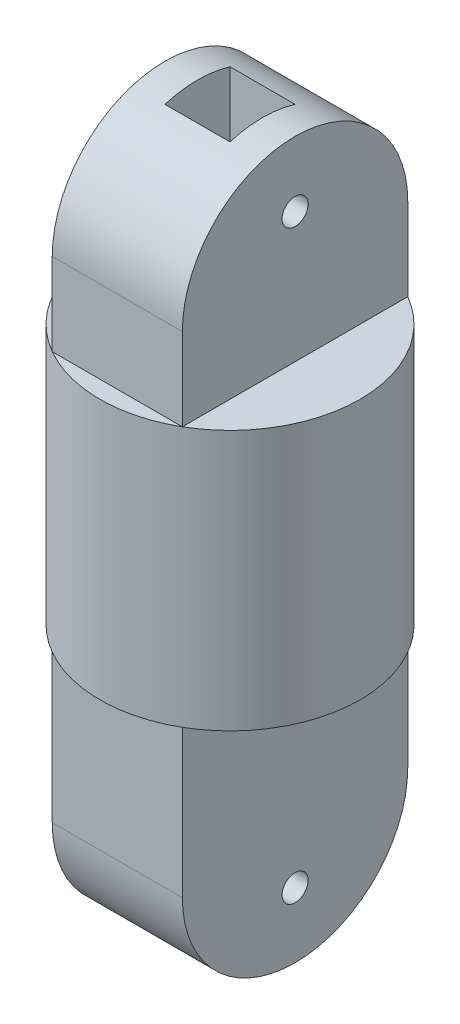
ISO-10303-21;
HEADER;
FILE_DESCRIPTION(('STEP AP214'),'2;1');
FILE_NAME('part.step','',(''),(''),'','','');
FILE_SCHEMA(('AUTOMOTIVE_DESIGN { 1 0 10303 214 1 1 1 1 }'));
ENDSEC;
DATA;
#1=APPLICATION_CONTEXT('core data for automotive mechanical design processes');
#2=APPLICATION_PROTOCOL_DEFINITION('international standard','automotive_design',2000,#1);
#3=PRODUCT_CONTEXT('',#1,'mechanical');
#4=PRODUCT('Part','Part','',(#3));
#5=PRODUCT_RELATED_PRODUCT_CATEGORY('part','',(#4));
#6=PRODUCT_DEFINITION_FORMATION('','',#4);
#7=PRODUCT_DEFINITION_CONTEXT('part definition',#1,'design');
#8=PRODUCT_DEFINITION('design','',#6,#7);
#9=PRODUCT_DEFINITION_SHAPE('','',#8);
#10=(LENGTH_UNIT() NAMED_UNIT(*) SI_UNIT(.MILLI.,.METRE.));
#11=(NAMED_UNIT(*) PLANE_ANGLE_UNIT() SI_UNIT($,.RADIAN.));
#12=(NAMED_UNIT(*) SI_UNIT($,.STERADIAN.) SOLID_ANGLE_UNIT());
#13=UNCERTAINTY_MEASURE_WITH_UNIT(LENGTH_MEASURE(1.E-05),#10,'distance_accuracy_value','');
#14=(GEOMETRIC_REPRESENTATION_CONTEXT(3) GLOBAL_UNCERTAINTY_ASSIGNED_CONTEXT((#13)) GLOBAL_UNIT_ASSIGNED_CONTEXT((#10,
#11,#12)) REPRESENTATION_CONTEXT('',''));
#15=CARTESIAN_POINT('',(0.,0.,0.));
#16=DIRECTION('',(0.,0.,1.));
#17=DIRECTION('',(1.,0.,0.));
#18=AXIS2_PLACEMENT_3D('',#15,#16,#17);
#19=CARTESIAN_POINT('',(-2.5,9.99999999892219,0.));
#20=DIRECTION('',(-1.,0.,0.));
#21=DIRECTION('',(0.,0.,1.));
#22=AXIS2_PLACEMENT_3D('',#19,#20,#21);
#23=CYLINDRICAL_SURFACE('',#22,0.500000015999993);
#24=CARTESIAN_POINT('',(1.25,9.99999999892219,0.));
#25=DIRECTION('',(1.,0.,0.));
#26=DIRECTION('',(0.,0.,-1.));
#27=AXIS2_PLACEMENT_3D('',#24,#25,#26);
#28=CIRCLE('',#27,0.500000015999993);
#29=CARTESIAN_POINT('',(1.25,9.99999999892219,-0.500000015999993));
#30=VERTEX_POINT('',#29);
#31=EDGE_CURVE('E148',#30,#30,#28,.F.);
#32=ORIENTED_EDGE('',*,*,#31,.T.);
#33=EDGE_LOOP('',(#32));
#34=FACE_BOUND('',#33,.T.);
#35=CARTESIAN_POINT('',(2.5,9.99999999892219,0.));
#36=DIRECTION('',(-1.,0.,0.));
#37=DIRECTION('',(0.,0.,1.));
#38=AXIS2_PLACEMENT_3D('',#35,#36,#37);
#39=CIRCLE('',#38,0.500000015999993);
#40=CARTESIAN_POINT('',(2.5,9.99999999892219,0.500000015999993));
#41=VERTEX_POINT('',#40);
#42=EDGE_CURVE('E291',#41,#41,#39,.T.);
#43=ORIENTED_EDGE('',*,*,#42,.F.);
#44=EDGE_LOOP('',(#43));
#45=FACE_BOUND('',#44,.T.);
#46=ADVANCED_FACE('F39',(#34,#45),#23,.F.);
#47=CARTESIAN_POINT('',(2.5,12.5,-4.33012701892219));
#48=DIRECTION('',(-1.,0.,0.));
#49=DIRECTION('',(0.,0.,1.));
#50=AXIS2_PLACEMENT_3D('',#47,#48,#49);
#51=PLANE('',#50);
#52=ORIENTED_EDGE('',*,*,#42,.T.);
#53=EDGE_LOOP('',(#52));
#54=FACE_BOUND('',#53,.T.);
#55=DIRECTION('',(0.,-1.,0.));
#56=VECTOR('',#55,1.);
#57=CARTESIAN_POINT('',(2.5,12.5,-4.33012701892219));
#58=LINE('',#57,#56);
#59=CARTESIAN_POINT('',(2.5,8.16987298,-4.33012701892219));
#60=VERTEX_POINT('',#59);
#61=CARTESIAN_POINT('',(2.5,5.,-4.33012701892219));
#62=VERTEX_POINT('',#61);
#63=EDGE_CURVE('E263',#60,#62,#58,.T.);
#64=ORIENTED_EDGE('',*,*,#63,.F.);
#65=CARTESIAN_POINT('',(2.5,8.16987298,0.));
#66=DIRECTION('',(-1.,0.,0.));
#67=DIRECTION('',(0.,0.,1.));
#68=AXIS2_PLACEMENT_3D('',#65,#66,#67);
#69=CIRCLE('',#68,4.33012701892219);
#70=CARTESIAN_POINT('',(2.5,8.16987298,4.33012701892219));
#71=VERTEX_POINT('',#70);
#72=EDGE_CURVE('E63',#60,#71,#69,.F.);
#73=ORIENTED_EDGE('',*,*,#72,.T.);
#74=DIRECTION('',(0.,-1.,0.));
#75=VECTOR('',#74,1.);
#76=CARTESIAN_POINT('',(2.5,12.5,4.33012701892219));
#77=LINE('',#76,#75);
#78=CARTESIAN_POINT('',(2.5,5.,4.33012701892219));
#79=VERTEX_POINT('',#78);
#80=EDGE_CURVE('E260',#71,#79,#77,.T.);
#81=ORIENTED_EDGE('',*,*,#80,.T.);
#82=DIRECTION('',(0.,0.,-1.));
#83=VECTOR('',#82,1.);
#84=CARTESIAN_POINT('',(2.5,5.,-4.33012701892219));
#85=LINE('',#84,#83);
#86=EDGE_CURVE('E266',#79,#62,#85,.T.);
#87=ORIENTED_EDGE('',*,*,#86,.T.);
#88=EDGE_LOOP('',(#64,#73,#81,#87));
#89=FACE_BOUND('',#88,.T.);
#90=ADVANCED_FACE('F315',(#54,#89),#51,.F.);
#91=CARTESIAN_POINT('',(-2.5,12.5,-4.33012701892219));
#92=DIRECTION('',(1.,0.,0.));
#93=DIRECTION('',(0.,0.,-1.));
#94=AXIS2_PLACEMENT_3D('',#91,#92,#93);
#95=PLANE('',#94);
#96=CARTESIAN_POINT('',(-2.5,9.99999999892219,0.));
#97=DIRECTION('',(-1.,0.,0.));
#98=DIRECTION('',(0.,0.,1.));
#99=AXIS2_PLACEMENT_3D('',#96,#97,#98);
#100=CIRCLE('',#99,0.500000015999988);
#101=CARTESIAN_POINT('',(-2.5,9.99999999892219,0.500000015999988));
#102=VERTEX_POINT('',#101);
#103=EDGE_CURVE('E295',#102,#102,#100,.T.);
#104=ORIENTED_EDGE('',*,*,#103,.F.);
#105=EDGE_LOOP('',(#104));
#106=FACE_BOUND('',#105,.T.);
#107=DIRECTION('',(0.,-1.,0.));
#108=VECTOR('',#107,1.);
#109=CARTESIAN_POINT('',(-2.5,12.5,4.33012701892219));
#110=LINE('',#109,#108);
#111=CARTESIAN_POINT('',(-2.5,8.16987298,4.33012701892219));
#112=VERTEX_POINT('',#111);
#113=CARTESIAN_POINT('',(-2.5,5.,4.33012701892219));
#114=VERTEX_POINT('',#113);
#115=EDGE_CURVE('E257',#112,#114,#110,.T.);
#116=ORIENTED_EDGE('',*,*,#115,.F.);
#117=CARTESIAN_POINT('',(-2.5,8.16987298,0.));
#118=DIRECTION('',(1.,0.,0.));
#119=DIRECTION('',(0.,0.,-1.));
#120=AXIS2_PLACEMENT_3D('',#117,#118,#119);
#121=CIRCLE('',#120,4.33012701892219);
#122=CARTESIAN_POINT('',(-2.5,8.16987298,-4.33012701892219));
#123=VERTEX_POINT('',#122);
#124=EDGE_CURVE('E288',#123,#112,#121,.T.);
#125=ORIENTED_EDGE('',*,*,#124,.F.);
#126=DIRECTION('',(0.,-1.,0.));
#127=VECTOR('',#126,1.);
#128=CARTESIAN_POINT('',(-2.5,12.5,-4.33012701892219));
#129=LINE('',#128,#127);
#130=CARTESIAN_POINT('',(-2.5,5.,-4.33012701892219));
#131=VERTEX_POINT('',#130);
#132=EDGE_CURVE('E254',#123,#131,#129,.T.);
#133=ORIENTED_EDGE('',*,*,#132,.T.);
#134=DIRECTION('',(0.,0.,1.));
#135=VECTOR('',#134,1.);
#136=CARTESIAN_POINT('',(-2.5,5.,-4.33012701892219));
#137=LINE('',#136,#135);
#138=EDGE_CURVE('E274',#131,#114,#137,.T.);
#139=ORIENTED_EDGE('',*,*,#138,.T.);
#140=EDGE_LOOP('',(#116,#125,#133,#139));
#141=FACE_BOUND('',#140,.T.);
#142=ADVANCED_FACE('F322',(#106,#141),#95,.F.);
#143=CARTESIAN_POINT('',(0.,5.,0.));
#144=DIRECTION('',(0.,1.,0.));
#145=DIRECTION('',(0.,0.,1.));
#146=AXIS2_PLACEMENT_3D('',#143,#144,#145);
#147=PLANE('',#146);
#148=DIRECTION('',(-1.,0.,0.));
#149=VECTOR('',#148,1.);
#150=CARTESIAN_POINT('',(-2.5,5.,-4.33012701892219));
#151=LINE('',#150,#149);
#152=EDGE_CURVE('E278',#62,#131,#151,.T.);
#153=ORIENTED_EDGE('',*,*,#152,.F.);
#154=CARTESIAN_POINT('',(0.,5.,0.));
#155=DIRECTION('',(0.,1.,0.));
#156=DIRECTION('',(0.,0.,1.));
#157=AXIS2_PLACEMENT_3D('',#154,#155,#156);
#158=CIRCLE('',#157,5.);
#159=EDGE_CURVE('E197',#62,#131,#158,.T.);
#160=ORIENTED_EDGE('',*,*,#159,.T.);
#161=EDGE_LOOP('',(#153,#160));
#162=FACE_BOUND('',#161,.T.);
#163=ADVANCED_FACE('F334',(#162),#147,.T.);
#164=ORIENTED_EDGE('',*,*,#86,.F.);
#165=EDGE_CURVE('E193',#79,#62,#158,.T.);
#166=ORIENTED_EDGE('',*,*,#165,.T.);
#167=EDGE_LOOP('',(#164,#166));
#168=FACE_BOUND('',#167,.T.);
#169=ADVANCED_FACE('F343',(#168),#147,.T.);
#170=DIRECTION('',(1.,0.,0.));
#171=VECTOR('',#170,1.);
#172=CARTESIAN_POINT('',(-2.5,5.,4.33012701892219));
#173=LINE('',#172,#171);
#174=EDGE_CURVE('E270',#114,#79,#173,.T.);
#175=ORIENTED_EDGE('',*,*,#174,.F.);
#176=EDGE_CURVE('E198',#114,#79,#158,.T.);
#177=ORIENTED_EDGE('',*,*,#176,.T.);
#178=EDGE_LOOP('',(#175,#177));
#179=FACE_BOUND('',#178,.T.);
#180=ADVANCED_FACE('F347',(#179),#147,.T.);
#181=ORIENTED_EDGE('',*,*,#138,.F.);
#182=EDGE_CURVE('E340',#131,#114,#158,.T.);
#183=ORIENTED_EDGE('',*,*,#182,.T.);
#184=EDGE_LOOP('',(#181,#183));
#185=FACE_BOUND('',#184,.T.);
#186=ADVANCED_FACE('F352',(#185),#147,.T.);
#187=CARTESIAN_POINT('',(7.5,-10.66987298,0.));
#188=DIRECTION('',(-1.,0.,0.));
#189=DIRECTION('',(0.,0.,1.));
#190=AXIS2_PLACEMENT_3D('',#187,#188,#189);
#191=CYLINDRICAL_SURFACE('',#190,4.3301270194611);
#192=DIRECTION('',(-1.,0.,0.));
#193=VECTOR('',#192,1.);
#194=CARTESIAN_POINT('',(7.5,-10.66987298,4.3301270194611));
#195=LINE('',#194,#193);
#196=CARTESIAN_POINT('',(2.5,-10.66987298,4.3301270194611));
#197=VERTEX_POINT('',#196);
#198=CARTESIAN_POINT('',(-2.5,-10.66987298,4.3301270194611));
#199=VERTEX_POINT('',#198);
#200=EDGE_CURVE('E230',#197,#199,#195,.T.);
#201=ORIENTED_EDGE('',*,*,#200,.T.);
#202=CARTESIAN_POINT('',(-2.5,-10.66987298,0.));
#203=DIRECTION('',(1.,0.,0.));
#204=DIRECTION('',(0.,0.,1.));
#205=AXIS2_PLACEMENT_3D('',#202,#203,#204);
#206=CIRCLE('',#205,4.3301270194611);
#207=CARTESIAN_POINT('',(-2.5,-10.66987298,-4.33012701892219));
#208=VERTEX_POINT('',#207);
#209=EDGE_CURVE('E186',#199,#208,#206,.T.);
#210=ORIENTED_EDGE('',*,*,#209,.T.);
#211=DIRECTION('',(-1.,0.,0.));
#212=VECTOR('',#211,1.);
#213=CARTESIAN_POINT('',(7.5,-10.66987298,-4.33012701892219));
#214=LINE('',#213,#212);
#215=CARTESIAN_POINT('',(2.5,-10.66987298,-4.33012701892219));
#216=VERTEX_POINT('',#215);
#217=EDGE_CURVE('E231',#216,#208,#214,.T.);
#218=ORIENTED_EDGE('',*,*,#217,.F.);
#219=CARTESIAN_POINT('',(2.5,-10.66987298,0.));
#220=DIRECTION('',(-1.,0.,0.));
#221=DIRECTION('',(0.,0.,1.));
#222=AXIS2_PLACEMENT_3D('',#219,#220,#221);
#223=CIRCLE('',#222,4.3301270194611);
#224=EDGE_CURVE('E227',#197,#216,#223,.F.);
#225=ORIENTED_EDGE('',*,*,#224,.F.);
#226=EDGE_LOOP('',(#201,#210,#218,#225));
#227=FACE_BOUND('',#226,.T.);
#228=CARTESIAN_POINT('',(-1.25,-10.66987298,0.));
#229=DIRECTION('',(1.,0.,0.));
#230=DIRECTION('',(0.,0.,-1.));
#231=AXIS2_PLACEMENT_3D('',#228,#229,#230);
#232=CIRCLE('',#231,4.3301270194611);
#233=CARTESIAN_POINT('',(-1.25,-14.8156539685071,1.25));
#234=VERTEX_POINT('',#233);
#235=CARTESIAN_POINT('',(-1.25,-14.8156539685071,-1.25));
#236=VERTEX_POINT('',#235);
#237=EDGE_CURVE('E136',#234,#236,#232,.T.);
#238=ORIENTED_EDGE('',*,*,#237,.F.);
#239=DIRECTION('',(-1.,0.,0.));
#240=VECTOR('',#239,1.);
#241=CARTESIAN_POINT('',(7.5,-14.8156539685071,1.25));
#242=LINE('',#241,#240);
#243=CARTESIAN_POINT('',(1.25,-14.8156539685071,1.25));
#244=VERTEX_POINT('',#243);
#245=EDGE_CURVE('E157',#244,#234,#242,.T.);
#246=ORIENTED_EDGE('',*,*,#245,.F.);
#247=CARTESIAN_POINT('',(1.25,-10.66987298,0.));
#248=DIRECTION('',(-1.,0.,0.));
#249=DIRECTION('',(0.,0.,1.));
#250=AXIS2_PLACEMENT_3D('',#247,#248,#249);
#251=CIRCLE('',#250,4.3301270194611);
#252=CARTESIAN_POINT('',(1.25,-14.8156539685071,-1.25));
#253=VERTEX_POINT('',#252);
#254=EDGE_CURVE('E177',#253,#244,#251,.T.);
#255=ORIENTED_EDGE('',*,*,#254,.F.);
#256=DIRECTION('',(-1.,0.,0.));
#257=VECTOR('',#256,1.);
#258=CARTESIAN_POINT('',(7.5,-14.8156539685071,-1.25));
#259=LINE('',#258,#257);
#260=EDGE_CURVE('E169',#236,#253,#259,.F.);
#261=ORIENTED_EDGE('',*,*,#260,.F.);
#262=EDGE_LOOP('',(#238,#246,#255,#261));
#263=FACE_BOUND('',#262,.T.);
#264=ADVANCED_FACE('F305',(#227,#263),#191,.T.);
#265=CARTESIAN_POINT('',(-2.5,-12.4999999991916,0.));
#266=DIRECTION('',(-1.,0.,0.));
#267=DIRECTION('',(0.,0.,1.));
#268=AXIS2_PLACEMENT_3D('',#265,#266,#267);
#269=CYLINDRICAL_SURFACE('',#268,0.500000015999999);
#270=CARTESIAN_POINT('',(2.5,-12.4999999991916,0.));
#271=DIRECTION('',(-1.,0.,0.));
#272=DIRECTION('',(0.,0.,1.));
#273=AXIS2_PLACEMENT_3D('',#270,#271,#272);
#274=CIRCLE('',#273,0.500000015999999);
#275=CARTESIAN_POINT('',(2.5,-12.4999999991916,0.500000015999999));
#276=VERTEX_POINT('',#275);
#277=EDGE_CURVE('E182',#276,#276,#274,.T.);
#278=ORIENTED_EDGE('',*,*,#277,.F.);
#279=EDGE_LOOP('',(#278));
#280=FACE_BOUND('',#279,.T.);
#281=CARTESIAN_POINT('',(1.25,-12.4999999991916,0.));
#282=DIRECTION('',(-1.,0.,0.));
#283=DIRECTION('',(0.,0.,1.));
#284=AXIS2_PLACEMENT_3D('',#281,#282,#283);
#285=CIRCLE('',#284,0.500000015999999);
#286=CARTESIAN_POINT('',(1.25,-12.4999999991916,0.500000015999999));
#287=VERTEX_POINT('',#286);
#288=EDGE_CURVE('E173',#287,#287,#285,.F.);
#289=ORIENTED_EDGE('',*,*,#288,.F.);
#290=EDGE_LOOP('',(#289));
#291=FACE_BOUND('',#290,.T.);
#292=ADVANCED_FACE('F379',(#280,#291),#269,.F.);
#293=CARTESIAN_POINT('',(-2.5,-12.4999999991916,0.));
#294=DIRECTION('',(-1.,0.,0.));
#295=DIRECTION('',(0.,0.,1.));
#296=AXIS2_PLACEMENT_3D('',#293,#294,#295);
#297=CIRCLE('',#296,0.500000015999999);
#298=CARTESIAN_POINT('',(-2.5,-12.4999999991916,0.500000015999999));
#299=VERTEX_POINT('',#298);
#300=EDGE_CURVE('E187',#299,#299,#297,.T.);
#301=ORIENTED_EDGE('',*,*,#300,.T.);
#302=EDGE_LOOP('',(#301));
#303=FACE_BOUND('',#302,.T.);
#304=CARTESIAN_POINT('',(-1.25,-12.4999999991916,0.));
#305=DIRECTION('',(1.,0.,0.));
#306=DIRECTION('',(0.,0.,-1.));
#307=AXIS2_PLACEMENT_3D('',#304,#305,#306);
#308=CIRCLE('',#307,0.500000015999999);
#309=CARTESIAN_POINT('',(-1.25,-12.4999999991916,-0.500000015999999));
#310=VERTEX_POINT('',#309);
#311=EDGE_CURVE('E178',#310,#310,#308,.F.);
#312=ORIENTED_EDGE('',*,*,#311,.F.);
#313=EDGE_LOOP('',(#312));
#314=FACE_BOUND('',#313,.T.);
#315=ADVANCED_FACE('F382',(#303,#314),#269,.F.);
#316=CARTESIAN_POINT('',(-2.5,-15.,4.33012701892219));
#317=DIRECTION('',(1.,0.,0.));
#318=DIRECTION('',(0.,0.,-1.));
#319=AXIS2_PLACEMENT_3D('',#316,#317,#318);
#320=PLANE('',#319);
#321=ORIENTED_EDGE('',*,*,#300,.F.);
#322=EDGE_LOOP('',(#321));
#323=FACE_BOUND('',#322,.T.);
#324=DIRECTION('',(0.,1.,0.));
#325=VECTOR('',#324,1.);
#326=CARTESIAN_POINT('',(-2.5,-15.,-4.33012701892219));
#327=LINE('',#326,#325);
#328=CARTESIAN_POINT('',(-2.5,-5.,-4.33012701892219));
#329=VERTEX_POINT('',#328);
#330=EDGE_CURVE('E202',#208,#329,#327,.T.);
#331=ORIENTED_EDGE('',*,*,#330,.F.);
#332=ORIENTED_EDGE('',*,*,#209,.F.);
#333=DIRECTION('',(0.,1.,0.));
#334=VECTOR('',#333,1.);
#335=CARTESIAN_POINT('',(-2.5,-15.,4.33012701892219));
#336=LINE('',#335,#334);
#337=CARTESIAN_POINT('',(-2.5,-5.,4.33012701892219));
#338=VERTEX_POINT('',#337);
#339=EDGE_CURVE('E199',#199,#338,#336,.T.);
#340=ORIENTED_EDGE('',*,*,#339,.T.);
#341=DIRECTION('',(0.,0.,-1.));
#342=VECTOR('',#341,1.);
#343=CARTESIAN_POINT('',(-2.5,-5.,4.33012701892219));
#344=LINE('',#343,#342);
#345=EDGE_CURVE('E219',#338,#329,#344,.T.);
#346=ORIENTED_EDGE('',*,*,#345,.T.);
#347=EDGE_LOOP('',(#331,#332,#340,#346));
#348=FACE_BOUND('',#347,.T.);
#349=ADVANCED_FACE('F391',(#323,#348),#320,.F.);
#350=CARTESIAN_POINT('',(2.5,-15.,4.33012701892219));
#351=DIRECTION('',(-1.,0.,0.));
#352=DIRECTION('',(0.,0.,1.));
#353=AXIS2_PLACEMENT_3D('',#350,#351,#352);
#354=PLANE('',#353);
#355=ORIENTED_EDGE('',*,*,#277,.T.);
#356=EDGE_LOOP('',(#355));
#357=FACE_BOUND('',#356,.T.);
#358=DIRECTION('',(0.,1.,0.));
#359=VECTOR('',#358,1.);
#360=CARTESIAN_POINT('',(2.5,-15.,4.33012701892219));
#361=LINE('',#360,#359);
#362=CARTESIAN_POINT('',(2.5,-5.,4.33012701892219));
#363=VERTEX_POINT('',#362);
#364=EDGE_CURVE('E208',#197,#363,#361,.T.);
#365=ORIENTED_EDGE('',*,*,#364,.F.);
#366=ORIENTED_EDGE('',*,*,#224,.T.);
#367=DIRECTION('',(0.,1.,0.));
#368=VECTOR('',#367,1.);
#369=CARTESIAN_POINT('',(2.5,-15.,-4.33012701892219));
#370=LINE('',#369,#368);
#371=CARTESIAN_POINT('',(2.5,-5.,-4.33012701892219));
#372=VERTEX_POINT('',#371);
#373=EDGE_CURVE('E205',#216,#372,#370,.T.);
#374=ORIENTED_EDGE('',*,*,#373,.T.);
#375=DIRECTION('',(0.,0.,1.));
#376=VECTOR('',#375,1.);
#377=CARTESIAN_POINT('',(2.5,-5.,4.33012701892219));
#378=LINE('',#377,#376);
#379=EDGE_CURVE('E211',#372,#363,#378,.T.);
#380=ORIENTED_EDGE('',*,*,#379,.T.);
#381=EDGE_LOOP('',(#365,#366,#374,#380));
#382=FACE_BOUND('',#381,.T.);
#383=ADVANCED_FACE('F387',(#357,#382),#354,.F.);
#384=CARTESIAN_POINT('',(0.,-5.,0.));
#385=DIRECTION('',(0.,1.,0.));
#386=DIRECTION('',(0.,0.,1.));
#387=AXIS2_PLACEMENT_3D('',#384,#385,#386);
#388=PLANE('',#387);
#389=DIRECTION('',(-1.,0.,0.));
#390=VECTOR('',#389,1.);
#391=CARTESIAN_POINT('',(-2.5,-5.,4.33012701892219));
#392=LINE('',#391,#390);
#393=EDGE_CURVE('E223',#363,#338,#392,.T.);
#394=ORIENTED_EDGE('',*,*,#393,.F.);
#395=CARTESIAN_POINT('',(0.,-5.,0.));
#396=DIRECTION('',(0.,1.,0.));
#397=DIRECTION('',(0.,0.,1.));
#398=AXIS2_PLACEMENT_3D('',#395,#396,#397);
#399=CIRCLE('',#398,5.);
#400=EDGE_CURVE('E192',#338,#363,#399,.T.);
#401=ORIENTED_EDGE('',*,*,#400,.F.);
#402=EDGE_LOOP('',(#394,#401));
#403=FACE_BOUND('',#402,.T.);
#404=ADVANCED_FACE('F390',(#403),#388,.F.);
#405=ORIENTED_EDGE('',*,*,#379,.F.);
#406=EDGE_CURVE('E172',#363,#372,#399,.T.);
#407=ORIENTED_EDGE('',*,*,#406,.F.);
#408=EDGE_LOOP('',(#405,#407));
#409=FACE_BOUND('',#408,.T.);
#410=ADVANCED_FACE('F405',(#409),#388,.F.);
#411=DIRECTION('',(1.,0.,0.));
#412=VECTOR('',#411,1.);
#413=CARTESIAN_POINT('',(-2.5,-5.,-4.33012701892219));
#414=LINE('',#413,#412);
#415=EDGE_CURVE('E215',#329,#372,#414,.T.);
#416=ORIENTED_EDGE('',*,*,#415,.F.);
#417=EDGE_CURVE('E191',#372,#329,#399,.T.);
#418=ORIENTED_EDGE('',*,*,#417,.F.);
#419=EDGE_LOOP('',(#416,#418));
#420=FACE_BOUND('',#419,.T.);
#421=ADVANCED_FACE('F411',(#420),#388,.F.);
#422=ORIENTED_EDGE('',*,*,#345,.F.);
#423=EDGE_CURVE('E427',#329,#338,#399,.T.);
#424=ORIENTED_EDGE('',*,*,#423,.F.);
#425=EDGE_LOOP('',(#422,#424));
#426=FACE_BOUND('',#425,.T.);
#427=ADVANCED_FACE('F407',(#426),#388,.F.);
#428=CARTESIAN_POINT('',(0.,-5.,0.));
#429=DIRECTION('',(0.,1.,0.));
#430=DIRECTION('',(0.,0.,1.));
#431=AXIS2_PLACEMENT_3D('',#428,#429,#430);
#432=CYLINDRICAL_SURFACE('',#431,5.);
#433=ORIENTED_EDGE('',*,*,#406,.T.);
#434=ORIENTED_EDGE('',*,*,#417,.T.);
#435=ORIENTED_EDGE('',*,*,#423,.T.);
#436=ORIENTED_EDGE('',*,*,#400,.T.);
#437=EDGE_LOOP('',(#433,#434,#435,#436));
#438=FACE_BOUND('',#437,.T.);
#439=ORIENTED_EDGE('',*,*,#165,.F.);
#440=ORIENTED_EDGE('',*,*,#176,.F.);
#441=ORIENTED_EDGE('',*,*,#182,.F.);
#442=ORIENTED_EDGE('',*,*,#159,.F.);
#443=EDGE_LOOP('',(#439,#440,#441,#442));
#444=FACE_BOUND('',#443,.T.);
#445=ADVANCED_FACE('F41',(#438,#444),#432,.T.);
#446=CARTESIAN_POINT('',(-2.5,-15.,4.33012701892219));
#447=DIRECTION('',(0.,0.,-1.));
#448=DIRECTION('',(-1.,0.,0.));
#449=AXIS2_PLACEMENT_3D('',#446,#447,#448);
#450=PLANE('',#449);
#451=ORIENTED_EDGE('',*,*,#339,.F.);
#452=ORIENTED_EDGE('',*,*,#200,.F.);
#453=ORIENTED_EDGE('',*,*,#364,.T.);
#454=ORIENTED_EDGE('',*,*,#393,.T.);
#455=EDGE_LOOP('',(#451,#452,#453,#454));
#456=FACE_BOUND('',#455,.T.);
#457=ADVANCED_FACE('F395',(#456),#450,.F.);
#458=CARTESIAN_POINT('',(-2.5,-15.,-4.33012701892219));
#459=DIRECTION('',(0.,0.,1.));
#460=DIRECTION('',(1.,0.,0.));
#461=AXIS2_PLACEMENT_3D('',#458,#459,#460);
#462=PLANE('',#461);
#463=ORIENTED_EDGE('',*,*,#373,.F.);
#464=ORIENTED_EDGE('',*,*,#217,.T.);
#465=ORIENTED_EDGE('',*,*,#330,.T.);
#466=ORIENTED_EDGE('',*,*,#415,.T.);
#467=EDGE_LOOP('',(#463,#464,#465,#466));
#468=FACE_BOUND('',#467,.T.);
#469=ADVANCED_FACE('F377',(#468),#462,.F.);
#470=CARTESIAN_POINT('',(-1.25,15.,-1.25));
#471=DIRECTION('',(0.,0.,1.));
#472=DIRECTION('',(1.,0.,0.));
#473=AXIS2_PLACEMENT_3D('',#470,#471,#472);
#474=PLANE('',#473);
#475=DIRECTION('',(0.,-1.,0.));
#476=VECTOR('',#475,1.);
#477=CARTESIAN_POINT('',(-1.25,15.,-1.25));
#478=LINE('',#477,#476);
#479=CARTESIAN_POINT('',(-1.25,12.3156539679442,-1.25));
#480=VERTEX_POINT('',#479);
#481=EDGE_CURVE('E130',#480,#236,#478,.T.);
#482=ORIENTED_EDGE('',*,*,#481,.T.);
#483=ORIENTED_EDGE('',*,*,#260,.T.);
#484=DIRECTION('',(0.,-1.,0.));
#485=VECTOR('',#484,1.);
#486=CARTESIAN_POINT('',(1.25,15.,-1.25));
#487=LINE('',#486,#485);
#488=CARTESIAN_POINT('',(1.25,12.3156539679442,-1.25));
#489=VERTEX_POINT('',#488);
#490=EDGE_CURVE('E141',#489,#253,#487,.T.);
#491=ORIENTED_EDGE('',*,*,#490,.F.);
#492=DIRECTION('',(-1.,0.,0.));
#493=VECTOR('',#492,1.);
#494=CARTESIAN_POINT('',(5.,12.3156539679442,-1.25));
#495=LINE('',#494,#493);
#496=EDGE_CURVE('E48',#480,#489,#495,.F.);
#497=ORIENTED_EDGE('',*,*,#496,.F.);
#498=EDGE_LOOP('',(#482,#483,#491,#497));
#499=FACE_BOUND('',#498,.T.);
#500=ADVANCED_FACE('F151',(#499),#474,.T.);
#501=CARTESIAN_POINT('',(-1.25,15.,1.25));
#502=DIRECTION('',(0.,0.,-1.));
#503=DIRECTION('',(-1.,0.,0.));
#504=AXIS2_PLACEMENT_3D('',#501,#502,#503);
#505=PLANE('',#504);
#506=DIRECTION('',(0.,-1.,0.));
#507=VECTOR('',#506,1.);
#508=CARTESIAN_POINT('',(1.25,15.,1.25));
#509=LINE('',#508,#507);
#510=CARTESIAN_POINT('',(1.25,12.3156539679442,1.25));
#511=VERTEX_POINT('',#510);
#512=EDGE_CURVE('E250',#511,#244,#509,.T.);
#513=ORIENTED_EDGE('',*,*,#512,.T.);
#514=ORIENTED_EDGE('',*,*,#245,.T.);
#515=DIRECTION('',(0.,-1.,0.));
#516=VECTOR('',#515,1.);
#517=CARTESIAN_POINT('',(-1.25,15.,1.25));
#518=LINE('',#517,#516);
#519=CARTESIAN_POINT('',(-1.25,12.3156539679442,1.25));
#520=VERTEX_POINT('',#519);
#521=EDGE_CURVE('E55',#520,#234,#518,.T.);
#522=ORIENTED_EDGE('',*,*,#521,.F.);
#523=DIRECTION('',(-1.,0.,0.));
#524=VECTOR('',#523,1.);
#525=CARTESIAN_POINT('',(5.,12.3156539679442,1.25));
#526=LINE('',#525,#524);
#527=EDGE_CURVE('E11',#511,#520,#526,.T.);
#528=ORIENTED_EDGE('',*,*,#527,.F.);
#529=EDGE_LOOP('',(#513,#514,#522,#528));
#530=FACE_BOUND('',#529,.T.);
#531=ADVANCED_FACE('F301',(#530),#505,.T.);
#532=CARTESIAN_POINT('',(1.25,15.,1.25));
#533=DIRECTION('',(-1.,0.,0.));
#534=DIRECTION('',(0.,0.,1.));
#535=AXIS2_PLACEMENT_3D('',#532,#533,#534);
#536=PLANE('',#535);
#537=ORIENTED_EDGE('',*,*,#288,.T.);
#538=EDGE_LOOP('',(#537));
#539=FACE_BOUND('',#538,.T.);
#540=ORIENTED_EDGE('',*,*,#490,.T.);
#541=ORIENTED_EDGE('',*,*,#254,.T.);
#542=ORIENTED_EDGE('',*,*,#512,.F.);
#543=CARTESIAN_POINT('',(1.25,8.16987298,0.));
#544=DIRECTION('',(1.,0.,0.));
#545=DIRECTION('',(0.,0.,-1.));
#546=AXIS2_PLACEMENT_3D('',#543,#544,#545);
#547=CIRCLE('',#546,4.33012701892219);
#548=EDGE_CURVE('E163',#489,#511,#547,.T.);
#549=ORIENTED_EDGE('',*,*,#548,.F.);
#550=EDGE_LOOP('',(#540,#541,#542,#549));
#551=FACE_BOUND('',#550,.T.);
#552=ORIENTED_EDGE('',*,*,#31,.F.);
#553=EDGE_LOOP('',(#552));
#554=FACE_BOUND('',#553,.T.);
#555=ADVANCED_FACE('F306',(#539,#551,#554),#536,.T.);
#556=CARTESIAN_POINT('',(-1.25,15.,1.25));
#557=DIRECTION('',(1.,0.,0.));
#558=DIRECTION('',(0.,0.,-1.));
#559=AXIS2_PLACEMENT_3D('',#556,#557,#558);
#560=PLANE('',#559);
#561=ORIENTED_EDGE('',*,*,#311,.T.);
#562=EDGE_LOOP('',(#561));
#563=FACE_BOUND('',#562,.T.);
#564=ORIENTED_EDGE('',*,*,#521,.T.);
#565=ORIENTED_EDGE('',*,*,#237,.T.);
#566=ORIENTED_EDGE('',*,*,#481,.F.);
#567=CARTESIAN_POINT('',(-1.25,8.16987298,0.));
#568=DIRECTION('',(-1.,0.,0.));
#569=DIRECTION('',(0.,0.,1.));
#570=AXIS2_PLACEMENT_3D('',#567,#568,#569);
#571=CIRCLE('',#570,4.33012701892219);
#572=EDGE_CURVE('E134',#520,#480,#571,.T.);
#573=ORIENTED_EDGE('',*,*,#572,.F.);
#574=EDGE_LOOP('',(#564,#565,#566,#573));
#575=FACE_BOUND('',#574,.T.);
#576=CARTESIAN_POINT('',(-1.25,9.99999999892219,0.));
#577=DIRECTION('',(-1.,0.,0.));
#578=DIRECTION('',(0.,0.,1.));
#579=AXIS2_PLACEMENT_3D('',#576,#577,#578);
#580=CIRCLE('',#579,0.500000015999993);
#581=CARTESIAN_POINT('',(-1.25,9.99999999892219,0.500000015999993));
#582=VERTEX_POINT('',#581);
#583=EDGE_CURVE('E149',#582,#582,#580,.F.);
#584=ORIENTED_EDGE('',*,*,#583,.F.);
#585=EDGE_LOOP('',(#584));
#586=FACE_BOUND('',#585,.T.);
#587=ADVANCED_FACE('F132',(#563,#575,#586),#560,.T.);
#588=CARTESIAN_POINT('',(-2.5,12.5,4.33012701892219));
#589=DIRECTION('',(0.,0.,-1.));
#590=DIRECTION('',(-1.,0.,0.));
#591=AXIS2_PLACEMENT_3D('',#588,#589,#590);
#592=PLANE('',#591);
#593=ORIENTED_EDGE('',*,*,#80,.F.);
#594=DIRECTION('',(-1.,0.,0.));
#595=VECTOR('',#594,1.);
#596=CARTESIAN_POINT('',(5.,8.16987298,4.33012701892219));
#597=LINE('',#596,#595);
#598=EDGE_CURVE('E284',#71,#112,#597,.T.);
#599=ORIENTED_EDGE('',*,*,#598,.T.);
#600=ORIENTED_EDGE('',*,*,#115,.T.);
#601=ORIENTED_EDGE('',*,*,#174,.T.);
#602=EDGE_LOOP('',(#593,#599,#600,#601));
#603=FACE_BOUND('',#602,.T.);
#604=ADVANCED_FACE('F362',(#603),#592,.F.);
#605=CARTESIAN_POINT('',(-2.5,12.5,-4.33012701892219));
#606=DIRECTION('',(0.,0.,1.));
#607=DIRECTION('',(1.,0.,0.));
#608=AXIS2_PLACEMENT_3D('',#605,#606,#607);
#609=PLANE('',#608);
#610=ORIENTED_EDGE('',*,*,#132,.F.);
#611=DIRECTION('',(1.,0.,0.));
#612=VECTOR('',#611,1.);
#613=CARTESIAN_POINT('',(-2.5,8.16987298,-4.33012701892219));
#614=LINE('',#613,#612);
#615=EDGE_CURVE('E155',#123,#60,#614,.T.);
#616=ORIENTED_EDGE('',*,*,#615,.T.);
#617=ORIENTED_EDGE('',*,*,#63,.T.);
#618=ORIENTED_EDGE('',*,*,#152,.T.);
#619=EDGE_LOOP('',(#610,#616,#617,#618));
#620=FACE_BOUND('',#619,.T.);
#621=ADVANCED_FACE('F330',(#620),#609,.F.);
#622=CARTESIAN_POINT('',(5.,8.16987298,0.));
#623=DIRECTION('',(-1.,0.,0.));
#624=DIRECTION('',(0.,0.,1.));
#625=AXIS2_PLACEMENT_3D('',#622,#623,#624);
#626=CYLINDRICAL_SURFACE('',#625,4.33012701892219);
#627=ORIENTED_EDGE('',*,*,#527,.T.);
#628=ORIENTED_EDGE('',*,*,#572,.T.);
#629=ORIENTED_EDGE('',*,*,#496,.T.);
#630=ORIENTED_EDGE('',*,*,#548,.T.);
#631=EDGE_LOOP('',(#627,#628,#629,#630));
#632=FACE_BOUND('',#631,.T.);
#633=ORIENTED_EDGE('',*,*,#124,.T.);
#634=ORIENTED_EDGE('',*,*,#598,.F.);
#635=ORIENTED_EDGE('',*,*,#72,.F.);
#636=ORIENTED_EDGE('',*,*,#615,.F.);
#637=EDGE_LOOP('',(#633,#634,#635,#636));
#638=FACE_BOUND('',#637,.T.);
#639=ADVANCED_FACE('F145',(#632,#638),#626,.T.);
#640=ORIENTED_EDGE('',*,*,#583,.T.);
#641=EDGE_LOOP('',(#640));
#642=FACE_BOUND('',#641,.T.);
#643=ORIENTED_EDGE('',*,*,#103,.T.);
#644=EDGE_LOOP('',(#643));
#645=FACE_BOUND('',#644,.T.);
#646=ADVANCED_FACE('F317',(#642,#645),#23,.F.);
#647=CLOSED_SHELL('',(#46,#90,#142,#163,#169,#180,#186,#264,#292,#315,#349,#383,#404,#410,#421,
#427,#445,#457,#469,#500,#531,#555,#587,#604,#621,#639,#646));
#648=MANIFOLD_SOLID_BREP('B2',#647);
#649=ADVANCED_BREP_SHAPE_REPRESENTATION('',(#18,#648),#14);
#650=SHAPE_DEFINITION_REPRESENTATION(#9,#649);
ENDSEC;
END-ISO-10303-21;
